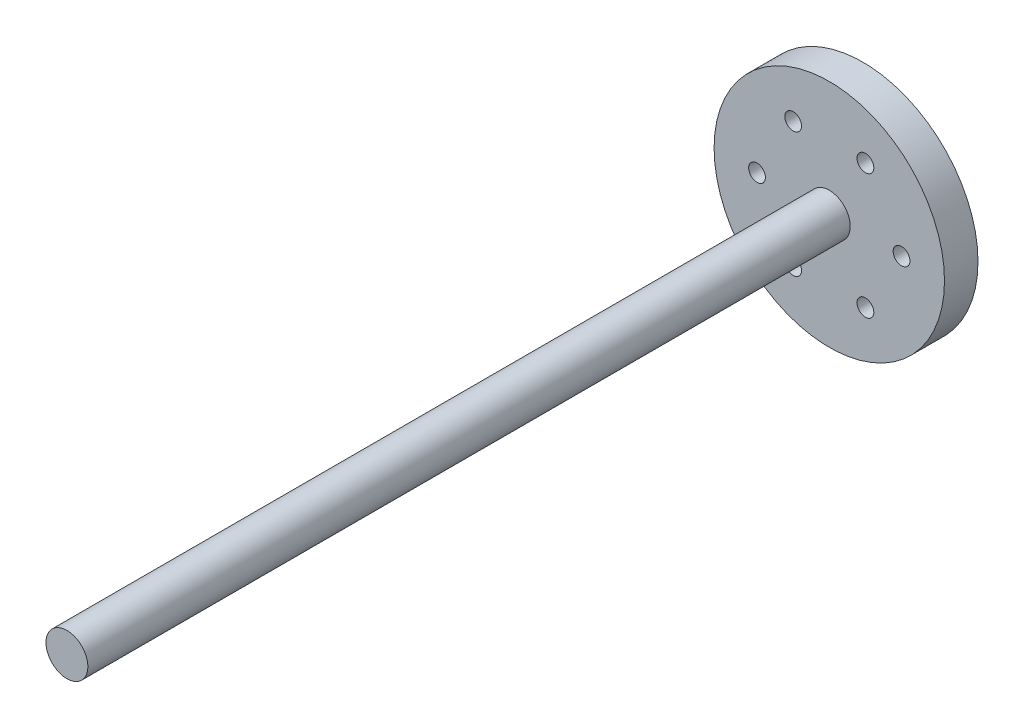
ISO-10303-21;
HEADER;
FILE_DESCRIPTION(('STEP AP214'),'2;1');
FILE_NAME('part.step','',(''),(''),'','','');
FILE_SCHEMA(('AUTOMOTIVE_DESIGN { 1 0 10303 214 1 1 1 1 }'));
ENDSEC;
DATA;
#1=APPLICATION_CONTEXT('core data for automotive mechanical design processes');
#2=APPLICATION_PROTOCOL_DEFINITION('international standard','automotive_design',2000,#1);
#3=PRODUCT_CONTEXT('',#1,'mechanical');
#4=PRODUCT('Part','Part','',(#3));
#5=PRODUCT_RELATED_PRODUCT_CATEGORY('part','',(#4));
#6=PRODUCT_DEFINITION_FORMATION('','',#4);
#7=PRODUCT_DEFINITION_CONTEXT('part definition',#1,'design');
#8=PRODUCT_DEFINITION('design','',#6,#7);
#9=PRODUCT_DEFINITION_SHAPE('','',#8);
#10=(LENGTH_UNIT() NAMED_UNIT(*) SI_UNIT(.MILLI.,.METRE.));
#11=(NAMED_UNIT(*) PLANE_ANGLE_UNIT() SI_UNIT($,.RADIAN.));
#12=(NAMED_UNIT(*) SI_UNIT($,.STERADIAN.) SOLID_ANGLE_UNIT());
#13=UNCERTAINTY_MEASURE_WITH_UNIT(LENGTH_MEASURE(1.E-05),#10,'distance_accuracy_value','');
#14=(GEOMETRIC_REPRESENTATION_CONTEXT(3) GLOBAL_UNCERTAINTY_ASSIGNED_CONTEXT((#13)) GLOBAL_UNIT_ASSIGNED_CONTEXT((#10,
#11,#12)) REPRESENTATION_CONTEXT('',''));
#15=CARTESIAN_POINT('',(0.,0.,0.));
#16=DIRECTION('',(0.,0.,1.));
#17=DIRECTION('',(1.,0.,0.));
#18=AXIS2_PLACEMENT_3D('',#15,#16,#17);
#19=CARTESIAN_POINT('',(0.,0.,8.));
#20=DIRECTION('',(0.,0.,1.));
#21=DIRECTION('',(1.,0.,0.));
#22=AXIS2_PLACEMENT_3D('',#19,#20,#21);
#23=PLANE('',#22);
#24=CARTESIAN_POINT('',(0.,0.,8.));
#25=DIRECTION('',(0.,0.,1.));
#26=DIRECTION('',(1.,0.,0.));
#27=AXIS2_PLACEMENT_3D('',#24,#25,#26);
#28=CIRCLE('',#27,5.);
#29=CARTESIAN_POINT('',(5.,0.,8.));
#30=VERTEX_POINT('',#29);
#31=EDGE_CURVE('E86',#30,#30,#28,.T.);
#32=ORIENTED_EDGE('',*,*,#31,.F.);
#33=EDGE_LOOP('',(#32));
#34=FACE_BOUND('',#33,.T.);
#35=CARTESIAN_POINT('',(8.62499999999986,-14.9389382152816,8.));
#36=DIRECTION('',(0.,0.,1.));
#37=DIRECTION('',(1.,0.,0.));
#38=AXIS2_PLACEMENT_3D('',#35,#36,#37);
#39=CIRCLE('',#38,2.);
#40=CARTESIAN_POINT('',(10.6249999999999,-14.9389382152816,8.));
#41=VERTEX_POINT('',#40);
#42=EDGE_CURVE('E71',#41,#41,#39,.T.);
#43=ORIENTED_EDGE('',*,*,#42,.F.);
#44=EDGE_LOOP('',(#43));
#45=FACE_BOUND('',#44,.T.);
#46=CARTESIAN_POINT('',(8.62500000000007,14.9389382152815,8.));
#47=DIRECTION('',(0.,0.,1.));
#48=DIRECTION('',(1.,0.,0.));
#49=AXIS2_PLACEMENT_3D('',#46,#47,#48);
#50=CIRCLE('',#49,2.);
#51=CARTESIAN_POINT('',(10.6250000000001,14.9389382152815,8.));
#52=VERTEX_POINT('',#51);
#53=EDGE_CURVE('E59',#52,#52,#50,.T.);
#54=ORIENTED_EDGE('',*,*,#53,.F.);
#55=EDGE_LOOP('',(#54));
#56=FACE_BOUND('',#55,.T.);
#57=CARTESIAN_POINT('',(-17.25,0.,8.));
#58=DIRECTION('',(0.,0.,1.));
#59=DIRECTION('',(1.,0.,0.));
#60=AXIS2_PLACEMENT_3D('',#57,#58,#59);
#61=CIRCLE('',#60,2.);
#62=CARTESIAN_POINT('',(-15.25,0.,8.));
#63=VERTEX_POINT('',#62);
#64=EDGE_CURVE('E48',#63,#63,#61,.T.);
#65=ORIENTED_EDGE('',*,*,#64,.F.);
#66=EDGE_LOOP('',(#65));
#67=FACE_BOUND('',#66,.T.);
#68=CARTESIAN_POINT('',(0.,0.,8.));
#69=DIRECTION('',(0.,0.,1.));
#70=DIRECTION('',(1.,0.,0.));
#71=AXIS2_PLACEMENT_3D('',#68,#69,#70);
#72=CIRCLE('',#71,27.5);
#73=CARTESIAN_POINT('',(27.5,0.,8.));
#74=VERTEX_POINT('',#73);
#75=EDGE_CURVE('E10',#74,#74,#72,.T.);
#76=ORIENTED_EDGE('',*,*,#75,.T.);
#77=EDGE_LOOP('',(#76));
#78=FACE_BOUND('',#77,.T.);
#79=CARTESIAN_POINT('',(-8.62499999999997,14.9389382152816,8.));
#80=DIRECTION('',(0.,0.,1.));
#81=DIRECTION('',(1.,0.,0.));
#82=AXIS2_PLACEMENT_3D('',#79,#80,#81);
#83=CIRCLE('',#82,2.);
#84=CARTESIAN_POINT('',(-6.62499999999997,14.9389382152816,8.));
#85=VERTEX_POINT('',#84);
#86=EDGE_CURVE('E53',#85,#85,#83,.T.);
#87=ORIENTED_EDGE('',*,*,#86,.F.);
#88=EDGE_LOOP('',(#87));
#89=FACE_BOUND('',#88,.T.);
#90=CARTESIAN_POINT('',(17.25,-1.20456106190088E-13,8.));
#91=DIRECTION('',(0.,0.,1.));
#92=DIRECTION('',(1.,0.,0.));
#93=AXIS2_PLACEMENT_3D('',#90,#91,#92);
#94=CIRCLE('',#93,2.);
#95=CARTESIAN_POINT('',(19.25,-1.20456106190088E-13,8.));
#96=VERTEX_POINT('',#95);
#97=EDGE_CURVE('E65',#96,#96,#94,.T.);
#98=ORIENTED_EDGE('',*,*,#97,.F.);
#99=EDGE_LOOP('',(#98));
#100=FACE_BOUND('',#99,.T.);
#101=CARTESIAN_POINT('',(-8.62500000000018,-14.9389382152815,8.));
#102=DIRECTION('',(0.,0.,1.));
#103=DIRECTION('',(1.,0.,0.));
#104=AXIS2_PLACEMENT_3D('',#101,#102,#103);
#105=CIRCLE('',#104,2.);
#106=CARTESIAN_POINT('',(-6.62500000000018,-14.9389382152815,8.));
#107=VERTEX_POINT('',#106);
#108=EDGE_CURVE('E77',#107,#107,#105,.T.);
#109=ORIENTED_EDGE('',*,*,#108,.F.);
#110=EDGE_LOOP('',(#109));
#111=FACE_BOUND('',#110,.T.);
#112=ADVANCED_FACE('F37',(#34,#45,#56,#67,#78,#89,#100,#111),#23,.T.);
#113=CARTESIAN_POINT('',(0.,0.,0.));
#114=DIRECTION('',(0.,0.,1.));
#115=DIRECTION('',(1.,0.,0.));
#116=AXIS2_PLACEMENT_3D('',#113,#114,#115);
#117=PLANE('',#116);
#118=CARTESIAN_POINT('',(0.,0.,0.));
#119=DIRECTION('',(0.,0.,1.));
#120=DIRECTION('',(1.,0.,0.));
#121=AXIS2_PLACEMENT_3D('',#118,#119,#120);
#122=CIRCLE('',#121,27.5);
#123=CARTESIAN_POINT('',(27.5,0.,0.));
#124=VERTEX_POINT('',#123);
#125=EDGE_CURVE('E41',#124,#124,#122,.T.);
#126=ORIENTED_EDGE('',*,*,#125,.F.);
#127=EDGE_LOOP('',(#126));
#128=FACE_BOUND('',#127,.T.);
#129=CARTESIAN_POINT('',(-17.25,0.,0.));
#130=DIRECTION('',(0.,0.,1.));
#131=DIRECTION('',(1.,0.,0.));
#132=AXIS2_PLACEMENT_3D('',#129,#130,#131);
#133=CIRCLE('',#132,2.);
#134=CARTESIAN_POINT('',(-15.25,0.,0.));
#135=VERTEX_POINT('',#134);
#136=EDGE_CURVE('E50',#135,#135,#133,.T.);
#137=ORIENTED_EDGE('',*,*,#136,.T.);
#138=EDGE_LOOP('',(#137));
#139=FACE_BOUND('',#138,.T.);
#140=CARTESIAN_POINT('',(-8.62499999999997,14.9389382152816,0.));
#141=DIRECTION('',(0.,0.,1.));
#142=DIRECTION('',(1.,0.,0.));
#143=AXIS2_PLACEMENT_3D('',#140,#141,#142);
#144=CIRCLE('',#143,2.);
#145=CARTESIAN_POINT('',(-6.62499999999997,14.9389382152816,0.));
#146=VERTEX_POINT('',#145);
#147=EDGE_CURVE('E56',#146,#146,#144,.T.);
#148=ORIENTED_EDGE('',*,*,#147,.T.);
#149=EDGE_LOOP('',(#148));
#150=FACE_BOUND('',#149,.T.);
#151=CARTESIAN_POINT('',(8.62500000000007,14.9389382152815,0.));
#152=DIRECTION('',(0.,0.,1.));
#153=DIRECTION('',(1.,0.,0.));
#154=AXIS2_PLACEMENT_3D('',#151,#152,#153);
#155=CIRCLE('',#154,2.);
#156=CARTESIAN_POINT('',(10.6250000000001,14.9389382152815,0.));
#157=VERTEX_POINT('',#156);
#158=EDGE_CURVE('E62',#157,#157,#155,.T.);
#159=ORIENTED_EDGE('',*,*,#158,.T.);
#160=EDGE_LOOP('',(#159));
#161=FACE_BOUND('',#160,.T.);
#162=CARTESIAN_POINT('',(17.25,-1.20456106190088E-13,0.));
#163=DIRECTION('',(0.,0.,1.));
#164=DIRECTION('',(1.,0.,0.));
#165=AXIS2_PLACEMENT_3D('',#162,#163,#164);
#166=CIRCLE('',#165,2.);
#167=CARTESIAN_POINT('',(19.25,-1.20456106190088E-13,0.));
#168=VERTEX_POINT('',#167);
#169=EDGE_CURVE('E68',#168,#168,#166,.T.);
#170=ORIENTED_EDGE('',*,*,#169,.T.);
#171=EDGE_LOOP('',(#170));
#172=FACE_BOUND('',#171,.T.);
#173=CARTESIAN_POINT('',(8.62499999999986,-14.9389382152816,0.));
#174=DIRECTION('',(0.,0.,1.));
#175=DIRECTION('',(1.,0.,0.));
#176=AXIS2_PLACEMENT_3D('',#173,#174,#175);
#177=CIRCLE('',#176,2.);
#178=CARTESIAN_POINT('',(10.6249999999999,-14.9389382152816,0.));
#179=VERTEX_POINT('',#178);
#180=EDGE_CURVE('E74',#179,#179,#177,.T.);
#181=ORIENTED_EDGE('',*,*,#180,.T.);
#182=EDGE_LOOP('',(#181));
#183=FACE_BOUND('',#182,.T.);
#184=CARTESIAN_POINT('',(-8.62500000000018,-14.9389382152815,0.));
#185=DIRECTION('',(0.,0.,1.));
#186=DIRECTION('',(1.,0.,0.));
#187=AXIS2_PLACEMENT_3D('',#184,#185,#186);
#188=CIRCLE('',#187,2.);
#189=CARTESIAN_POINT('',(-6.62500000000018,-14.9389382152815,0.));
#190=VERTEX_POINT('',#189);
#191=EDGE_CURVE('E80',#190,#190,#188,.T.);
#192=ORIENTED_EDGE('',*,*,#191,.T.);
#193=EDGE_LOOP('',(#192));
#194=FACE_BOUND('',#193,.T.);
#195=ADVANCED_FACE('F103',(#128,#139,#150,#161,#172,#183,#194),#117,.F.);
#196=CARTESIAN_POINT('',(0.,0.,8.));
#197=DIRECTION('',(0.,0.,-1.));
#198=DIRECTION('',(-1.,0.,0.));
#199=AXIS2_PLACEMENT_3D('',#196,#197,#198);
#200=CYLINDRICAL_SURFACE('',#199,27.5);
#201=ORIENTED_EDGE('',*,*,#75,.F.);
#202=EDGE_LOOP('',(#201));
#203=FACE_BOUND('',#202,.T.);
#204=ORIENTED_EDGE('',*,*,#125,.T.);
#205=EDGE_LOOP('',(#204));
#206=FACE_BOUND('',#205,.T.);
#207=ADVANCED_FACE('F39',(#203,#206),#200,.T.);
#208=CARTESIAN_POINT('',(-17.25,0.,8.));
#209=DIRECTION('',(0.,0.,-1.));
#210=DIRECTION('',(-1.,0.,0.));
#211=AXIS2_PLACEMENT_3D('',#208,#209,#210);
#212=CYLINDRICAL_SURFACE('',#211,2.);
#213=ORIENTED_EDGE('',*,*,#64,.T.);
#214=EDGE_LOOP('',(#213));
#215=FACE_BOUND('',#214,.T.);
#216=ORIENTED_EDGE('',*,*,#136,.F.);
#217=EDGE_LOOP('',(#216));
#218=FACE_BOUND('',#217,.T.);
#219=ADVANCED_FACE('F128',(#215,#218),#212,.F.);
#220=CARTESIAN_POINT('',(-8.62499999999997,14.9389382152816,8.));
#221=DIRECTION('',(0.,0.,-1.));
#222=DIRECTION('',(-1.,0.,0.));
#223=AXIS2_PLACEMENT_3D('',#220,#221,#222);
#224=CYLINDRICAL_SURFACE('',#223,2.);
#225=ORIENTED_EDGE('',*,*,#86,.T.);
#226=EDGE_LOOP('',(#225));
#227=FACE_BOUND('',#226,.T.);
#228=ORIENTED_EDGE('',*,*,#147,.F.);
#229=EDGE_LOOP('',(#228));
#230=FACE_BOUND('',#229,.T.);
#231=ADVANCED_FACE('F135',(#227,#230),#224,.F.);
#232=CARTESIAN_POINT('',(8.62500000000007,14.9389382152815,8.));
#233=DIRECTION('',(0.,0.,-1.));
#234=DIRECTION('',(-1.,0.,0.));
#235=AXIS2_PLACEMENT_3D('',#232,#233,#234);
#236=CYLINDRICAL_SURFACE('',#235,2.);
#237=ORIENTED_EDGE('',*,*,#53,.T.);
#238=EDGE_LOOP('',(#237));
#239=FACE_BOUND('',#238,.T.);
#240=ORIENTED_EDGE('',*,*,#158,.F.);
#241=EDGE_LOOP('',(#240));
#242=FACE_BOUND('',#241,.T.);
#243=ADVANCED_FACE('F139',(#239,#242),#236,.F.);
#244=CARTESIAN_POINT('',(17.25,-1.20456106190088E-13,8.));
#245=DIRECTION('',(0.,0.,-1.));
#246=DIRECTION('',(-1.,0.,0.));
#247=AXIS2_PLACEMENT_3D('',#244,#245,#246);
#248=CYLINDRICAL_SURFACE('',#247,2.);
#249=ORIENTED_EDGE('',*,*,#97,.T.);
#250=EDGE_LOOP('',(#249));
#251=FACE_BOUND('',#250,.T.);
#252=ORIENTED_EDGE('',*,*,#169,.F.);
#253=EDGE_LOOP('',(#252));
#254=FACE_BOUND('',#253,.T.);
#255=ADVANCED_FACE('F143',(#251,#254),#248,.F.);
#256=CARTESIAN_POINT('',(8.62499999999986,-14.9389382152816,8.));
#257=DIRECTION('',(0.,0.,-1.));
#258=DIRECTION('',(-1.,0.,0.));
#259=AXIS2_PLACEMENT_3D('',#256,#257,#258);
#260=CYLINDRICAL_SURFACE('',#259,2.);
#261=ORIENTED_EDGE('',*,*,#42,.T.);
#262=EDGE_LOOP('',(#261));
#263=FACE_BOUND('',#262,.T.);
#264=ORIENTED_EDGE('',*,*,#180,.F.);
#265=EDGE_LOOP('',(#264));
#266=FACE_BOUND('',#265,.T.);
#267=ADVANCED_FACE('F119',(#263,#266),#260,.F.);
#268=CARTESIAN_POINT('',(-8.62500000000018,-14.9389382152815,8.));
#269=DIRECTION('',(0.,0.,-1.));
#270=DIRECTION('',(-1.,0.,0.));
#271=AXIS2_PLACEMENT_3D('',#268,#269,#270);
#272=CYLINDRICAL_SURFACE('',#271,2.);
#273=ORIENTED_EDGE('',*,*,#108,.T.);
#274=EDGE_LOOP('',(#273));
#275=FACE_BOUND('',#274,.T.);
#276=ORIENTED_EDGE('',*,*,#191,.F.);
#277=EDGE_LOOP('',(#276));
#278=FACE_BOUND('',#277,.T.);
#279=ADVANCED_FACE('F97',(#275,#278),#272,.F.);
#280=CARTESIAN_POINT('',(0.,0.,190.));
#281=DIRECTION('',(0.,0.,-1.));
#282=DIRECTION('',(-1.,0.,0.));
#283=AXIS2_PLACEMENT_3D('',#280,#281,#282);
#284=CYLINDRICAL_SURFACE('',#283,5.);
#285=CARTESIAN_POINT('',(0.,0.,190.));
#286=DIRECTION('',(0.,0.,1.));
#287=DIRECTION('',(1.,0.,0.));
#288=AXIS2_PLACEMENT_3D('',#285,#286,#287);
#289=CIRCLE('',#288,5.);
#290=CARTESIAN_POINT('',(5.,0.,190.));
#291=VERTEX_POINT('',#290);
#292=EDGE_CURVE('E83',#291,#291,#289,.T.);
#293=ORIENTED_EDGE('',*,*,#292,.F.);
#294=EDGE_LOOP('',(#293));
#295=FACE_BOUND('',#294,.T.);
#296=ORIENTED_EDGE('',*,*,#31,.T.);
#297=EDGE_LOOP('',(#296));
#298=FACE_BOUND('',#297,.T.);
#299=ADVANCED_FACE('F94',(#295,#298),#284,.T.);
#300=CARTESIAN_POINT('',(0.,0.,190.));
#301=DIRECTION('',(0.,0.,1.));
#302=DIRECTION('',(1.,0.,0.));
#303=AXIS2_PLACEMENT_3D('',#300,#301,#302);
#304=PLANE('',#303);
#305=ORIENTED_EDGE('',*,*,#292,.T.);
#306=EDGE_LOOP('',(#305));
#307=FACE_BOUND('',#306,.T.);
#308=ADVANCED_FACE('F92',(#307),#304,.T.);
#309=CLOSED_SHELL('',(#112,#195,#207,#219,#231,#243,#255,#267,#279,#299,#308));
#310=MANIFOLD_SOLID_BREP('B2',#309);
#311=ADVANCED_BREP_SHAPE_REPRESENTATION('',(#18,#310),#14);
#312=SHAPE_DEFINITION_REPRESENTATION(#9,#311);
ENDSEC;
END-ISO-10303-21;
